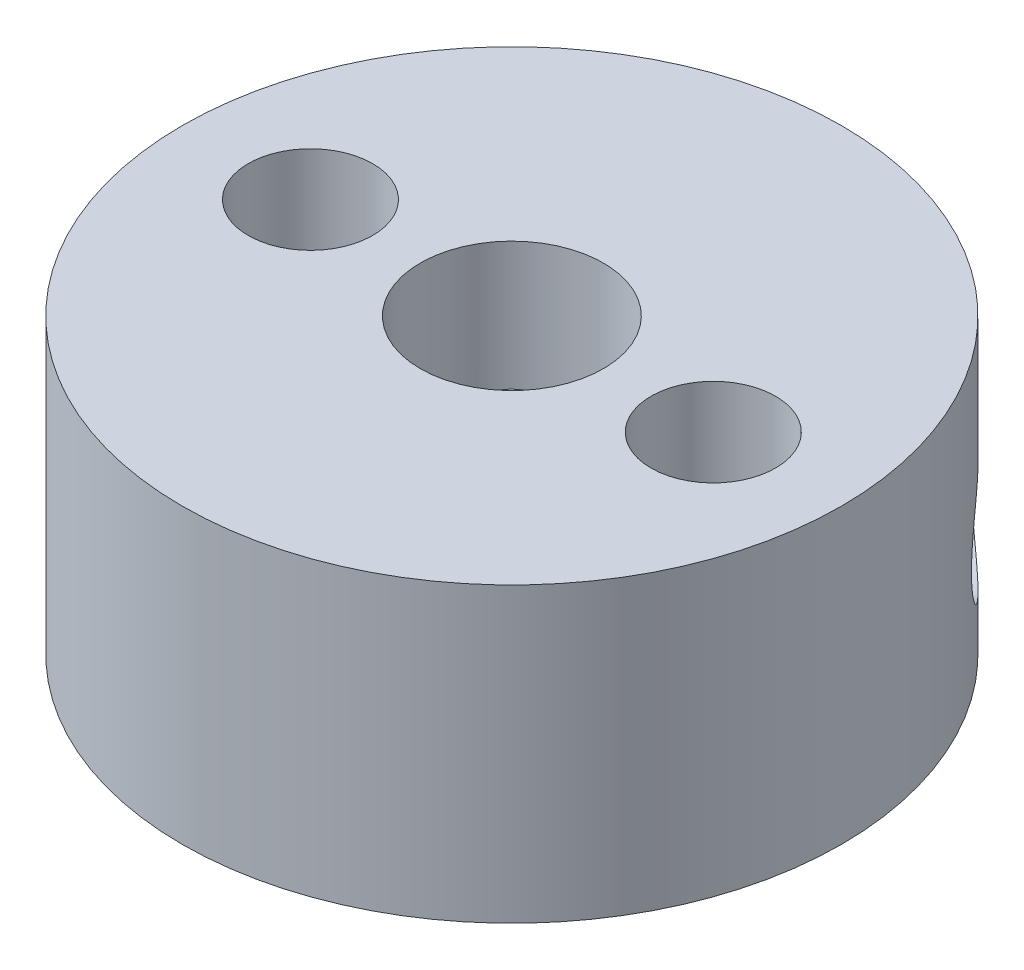
ISO-10303-21;
HEADER;
FILE_DESCRIPTION(('STEP AP214'),'2;1');
FILE_NAME('part.step','',(''),(''),'','','');
FILE_SCHEMA(('AUTOMOTIVE_DESIGN { 1 0 10303 214 1 1 1 1 }'));
ENDSEC;
DATA;
#1=APPLICATION_CONTEXT('core data for automotive mechanical design processes');
#2=APPLICATION_PROTOCOL_DEFINITION('international standard','automotive_design',2000,#1);
#3=PRODUCT_CONTEXT('',#1,'mechanical');
#4=PRODUCT('Part','Part','',(#3));
#5=PRODUCT_RELATED_PRODUCT_CATEGORY('part','',(#4));
#6=PRODUCT_DEFINITION_FORMATION('','',#4);
#7=PRODUCT_DEFINITION_CONTEXT('part definition',#1,'design');
#8=PRODUCT_DEFINITION('design','',#6,#7);
#9=PRODUCT_DEFINITION_SHAPE('','',#8);
#10=(LENGTH_UNIT() NAMED_UNIT(*) SI_UNIT(.MILLI.,.METRE.));
#11=(NAMED_UNIT(*) PLANE_ANGLE_UNIT() SI_UNIT($,.RADIAN.));
#12=(NAMED_UNIT(*) SI_UNIT($,.STERADIAN.) SOLID_ANGLE_UNIT());
#13=UNCERTAINTY_MEASURE_WITH_UNIT(LENGTH_MEASURE(1.E-05),#10,'distance_accuracy_value','');
#14=(GEOMETRIC_REPRESENTATION_CONTEXT(3) GLOBAL_UNCERTAINTY_ASSIGNED_CONTEXT((#13)) GLOBAL_UNIT_ASSIGNED_CONTEXT((#10,
#11,#12)) REPRESENTATION_CONTEXT('',''));
#15=CARTESIAN_POINT('',(0.,0.,0.));
#16=DIRECTION('',(0.,0.,1.));
#17=DIRECTION('',(1.,0.,0.));
#18=AXIS2_PLACEMENT_3D('',#15,#16,#17);
#19=CARTESIAN_POINT('',(0.,8.,0.));
#20=DIRECTION('',(0.,-1.,0.));
#21=DIRECTION('',(0.,0.,-1.));
#22=AXIS2_PLACEMENT_3D('',#19,#20,#21);
#23=CYLINDRICAL_SURFACE('',#22,9.);
#24=CARTESIAN_POINT('',(7.3356103707854,3.,-5.21429002722573));
#25=CARTESIAN_POINT('',(7.33560906179699,3.08362544888762,-5.21429347133471));
#26=CARTESIAN_POINT('',(7.3314935824208,3.16729656361492,-5.22009663199539));
#27=CARTESIAN_POINT('',(7.31507706919098,3.3322911259321,-5.24307536332879));
#28=CARTESIAN_POINT('',(7.30276848653905,3.41361233624971,-5.26026142167641));
#29=CARTESIAN_POINT('',(7.27014056128942,3.57149537001407,-5.30526373763786));
#30=CARTESIAN_POINT('',(7.24982791339226,3.64806110919979,-5.33307111085623));
#31=CARTESIAN_POINT('',(7.20147069847817,3.79438857282823,-5.39819015859343));
#32=CARTESIAN_POINT('',(7.1734270015503,3.86415106174574,-5.43550076353738));
#33=CARTESIAN_POINT('',(7.10972063245059,3.9955877098474,-5.51857125287341));
#34=CARTESIAN_POINT('',(7.07399292404927,4.05718507883191,-5.56440277761031));
#35=CARTESIAN_POINT('',(6.995625236568,4.16987598411691,-5.66261128747882));
#36=CARTESIAN_POINT('',(6.95298484807467,4.2209688978692,-5.71498866025553));
#37=CARTESIAN_POINT('',(6.86127498846877,4.31148874033161,-5.82477846281084));
#38=CARTESIAN_POINT('',(6.81216865669268,4.3508442046391,-5.88221908419585));
#39=CARTESIAN_POINT('',(6.70875322313891,4.41631264231832,-5.99989653222549));
#40=CARTESIAN_POINT('',(6.65444445992396,4.44242647673092,-6.06013317677978));
#41=CARTESIAN_POINT('',(6.54245362251156,4.48043552099034,-6.1808586801218));
#42=CARTESIAN_POINT('',(6.48480731247121,4.49245974960282,-6.24134007868412));
#43=CARTESIAN_POINT('',(6.36723892837099,4.50234945249156,-6.36123534952202));
#44=CARTESIAN_POINT('',(6.30731700927169,4.50021588914834,-6.42064929408283));
#45=CARTESIAN_POINT('',(6.187554745874,4.48195118908307,-6.53613195882861));
#46=CARTESIAN_POINT('',(6.12771947201005,4.46595890195451,-6.5922279835377));
#47=CARTESIAN_POINT('',(6.00937716266979,4.42064935545211,-6.70028439304207));
#48=CARTESIAN_POINT('',(5.95087016770395,4.3913316902463,-6.75224465182361));
#49=CARTESIAN_POINT('',(5.83680055263428,4.32006561581081,-6.85109387827042));
#50=CARTESIAN_POINT('',(5.78125263940363,4.27805999275054,-6.89795853845665));
#51=CARTESIAN_POINT('',(5.6752497105551,4.18265230641897,-6.98543275865623));
#52=CARTESIAN_POINT('',(5.62479510761948,4.12924932077351,-7.02604181195296));
#53=CARTESIAN_POINT('',(5.53016818209831,4.01179271602842,-7.10076938918105));
#54=CARTESIAN_POINT('',(5.48607950274169,3.94761774305941,-7.13480319252956));
#55=CARTESIAN_POINT('',(5.4065773438134,3.81084774587051,-7.19523612452328));
#56=CARTESIAN_POINT('',(5.37116394426471,3.73825264399031,-7.22163518274408));
#57=CARTESIAN_POINT('',(5.31038314614654,3.58656501487351,-7.26644791244958));
#58=CARTESIAN_POINT('',(5.28502704422252,3.50746530114475,-7.28485260662859));
#59=CARTESIAN_POINT('',(5.2454872496074,3.34509055661548,-7.31337566673685));
#60=CARTESIAN_POINT('',(5.23130257318053,3.26181589414055,-7.32349476228423));
#61=CARTESIAN_POINT('',(5.214823858166,3.09452030630272,-7.33523787599168));
#62=CARTESIAN_POINT('',(5.21238982988897,3.01052017217874,-7.33696190969075));
#63=CARTESIAN_POINT('',(5.21913859650674,2.84322799698551,-7.33216262818446));
#64=CARTESIAN_POINT('',(5.22832094270758,2.75993592869162,-7.32563963152882));
#65=CARTESIAN_POINT('',(5.25780894880967,2.59696334448549,-7.30450322393505));
#66=CARTESIAN_POINT('',(5.27804387945267,2.51726331607319,-7.28994125088023));
#67=CARTESIAN_POINT('',(5.32875141663331,2.36311790023231,-7.25295713819659));
#68=CARTESIAN_POINT('',(5.35922463560947,2.28867282746946,-7.23053452835318));
#69=CARTESIAN_POINT('',(5.42953410343629,2.14639524335634,-7.17788956661402));
#70=CARTESIAN_POINT('',(5.46945411987631,2.07863005634637,-7.14759718124592));
#71=CARTESIAN_POINT('',(5.55699261394945,1.952331880383,-7.07975227072709));
#72=CARTESIAN_POINT('',(5.60461163304169,1.89379954133416,-7.04219923490947));
#73=CARTESIAN_POINT('',(5.70636706168378,1.78700886436278,-6.96000635037759));
#74=CARTESIAN_POINT('',(5.76056610033209,1.73886370422928,-6.91529686201643));
#75=CARTESIAN_POINT('',(5.87317561280523,1.65500680379707,-6.81991532253652));
#76=CARTESIAN_POINT('',(5.93158595032937,1.61929466131569,-6.7692434643592));
#77=CARTESIAN_POINT('',(6.05038089421133,1.56149364962708,-6.66327196304475));
#78=CARTESIAN_POINT('',(6.11075568766486,1.53934555455905,-6.60799365357937));
#79=CARTESIAN_POINT('',(6.23177099454667,1.5091106406217,-6.49399226841619));
#80=CARTESIAN_POINT('',(6.29241148569924,1.50102266476058,-6.43526947657221));
#81=CARTESIAN_POINT('',(6.41138172764823,1.49917087061269,-6.31673581667009));
#82=CARTESIAN_POINT('',(6.46973056399896,1.50523484763537,-6.25694672375754));
#83=CARTESIAN_POINT('',(6.58327745018212,1.53114235336164,-6.13736575342292));
#84=CARTESIAN_POINT('',(6.63847551765573,1.55098580490574,-6.07757387601833));
#85=CARTESIAN_POINT('',(6.74429948508754,1.60382289932625,-5.95992309059098));
#86=CARTESIAN_POINT('',(6.79493039892556,1.63680190092627,-5.90206210789744));
#87=CARTESIAN_POINT('',(6.89060342251367,1.71495476173811,-5.79007901446971));
#88=CARTESIAN_POINT('',(6.93564526718358,1.76012919903658,-5.73595708112629));
#89=CARTESIAN_POINT('',(7.01978386374087,1.8620010554772,-5.63268393285002));
#90=CARTESIAN_POINT('',(7.05880658428743,1.91882457285412,-5.58359677706004));
#91=CARTESIAN_POINT('',(7.1296418120033,2.04211698473892,-5.49286168718718));
#92=CARTESIAN_POINT('',(7.16145262820669,2.10858813533493,-5.45121549826225));
#93=CARTESIAN_POINT('',(7.21757936392886,2.24984719350458,-5.37668546051094));
#94=CARTESIAN_POINT('',(7.24184067656554,2.32469060390283,-5.34386567595149));
#95=CARTESIAN_POINT('',(7.28219857113647,2.48016554154686,-5.28873908330745));
#96=CARTESIAN_POINT('',(7.29830331023487,2.56079119361814,-5.26642177357636));
#97=CARTESIAN_POINT('',(7.31867122213994,2.701442261686,-5.23805812236942));
#98=CARTESIAN_POINT('',(7.32501827640892,2.76061608477506,-5.22916445343277));
#99=CARTESIAN_POINT('',(7.33348828265055,2.87985209090466,-5.21727922212014));
#100=CARTESIAN_POINT('',(7.33561131130699,2.9399142577981,-5.21428755259813));
#101=CARTESIAN_POINT('',(7.3356103707854,3.,-5.21429002722573));
#102=B_SPLINE_CURVE_WITH_KNOTS('',3,(#24,#25,#26,#27,#28,#29,#30,#31,#32,#33,#34,#35,#36,#37,
#38,#39,#40,#41,#42,#43,#44,#45,#46,#47,#48,#49,#50,#51,#52,#53,#54,#55,#56,#57,#58,#59,#60,#61,
#62,#63,#64,#65,#66,#67,#68,#69,#70,#71,#72,#73,#74,#75,#76,#77,#78,#79,#80,#81,#82,#83,#84,#85,
#86,#87,#88,#89,#90,#91,#92,#93,#94,#95,#96,#97,#98,#99,#100,#101),.UNSPECIFIED.,.T.,.F.,(4,2,2,
2,2,2,2,2,2,2,2,2,2,2,2,2,2,2,2,2,2,2,2,2,2,2,2,2,2,2,2,2,2,2,2,2,2,2,4),(0.,0.250656623343192,
0.501544511951669,0.752222998698999,1.00287328440553,1.25573495490817,1.50861160698057,
1.7629978806425,2.01736761064056,2.26938940480928,2.52139406789004,2.7709027269619,
3.02041898547108,3.27107762481044,3.52175655733447,3.77547674074663,4.02919926445,
4.28320597496551,4.53719031560235,4.78814125449635,5.03908250045774,5.28843638778684,
5.53780519373533,5.7894740565501,6.04116062655802,6.29546467818618,6.54976050283408,
6.80293790647977,7.05609447544799,7.30618665756939,7.55627743928683,7.80609023896863,
8.0559148823279,8.3086019847534,8.56134827326476,8.8158823656771,9.07016140042576,
9.25026402322163,9.43036337636995),.UNSPECIFIED.);
#103=CARTESIAN_POINT('',(7.3356103707854,3.,-5.21429002722573));
#104=VERTEX_POINT('',#103);
#105=EDGE_CURVE('E81',#104,#104,#102,.T.);
#106=ORIENTED_EDGE('',*,*,#105,.T.);
#107=EDGE_LOOP('',(#106));
#108=FACE_BOUND('',#107,.T.);
#109=CARTESIAN_POINT('',(0.,8.,0.));
#110=DIRECTION('',(0.,1.,0.));
#111=DIRECTION('',(0.,0.,1.));
#112=AXIS2_PLACEMENT_3D('',#109,#110,#111);
#113=CIRCLE('',#112,9.);
#114=CARTESIAN_POINT('',(0.,8.,9.));
#115=VERTEX_POINT('',#114);
#116=EDGE_CURVE('E11',#115,#115,#113,.T.);
#117=ORIENTED_EDGE('',*,*,#116,.F.);
#118=EDGE_LOOP('',(#117));
#119=FACE_BOUND('',#118,.T.);
#120=CARTESIAN_POINT('',(0.,0.,0.));
#121=DIRECTION('',(0.,1.,0.));
#122=DIRECTION('',(0.,0.,1.));
#123=AXIS2_PLACEMENT_3D('',#120,#121,#122);
#124=CIRCLE('',#123,9.);
#125=CARTESIAN_POINT('',(0.,0.,9.));
#126=VERTEX_POINT('',#125);
#127=EDGE_CURVE('E65',#126,#126,#124,.T.);
#128=ORIENTED_EDGE('',*,*,#127,.T.);
#129=EDGE_LOOP('',(#128));
#130=FACE_BOUND('',#129,.T.);
#131=CARTESIAN_POINT('',(-5.21429002722576,3.,-7.33561037078538));
#132=CARTESIAN_POINT('',(-5.21429347133474,2.91637455111238,-7.33560906179697));
#133=CARTESIAN_POINT('',(-5.22009663199541,2.83270343638508,-7.33149358242078));
#134=CARTESIAN_POINT('',(-5.24307536332881,2.6677088740679,-7.31507706919096));
#135=CARTESIAN_POINT('',(-5.26026142167643,2.58638766375029,-7.30276848653903));
#136=CARTESIAN_POINT('',(-5.30526373763789,2.42850462998593,-7.2701405612894));
#137=CARTESIAN_POINT('',(-5.33307111085626,2.35193889080021,-7.24982791339224));
#138=CARTESIAN_POINT('',(-5.39819015859346,2.20561142717178,-7.20147069847815));
#139=CARTESIAN_POINT('',(-5.43550076353741,2.13584893825426,-7.17342700155028));
#140=CARTESIAN_POINT('',(-5.51857125287343,2.0044122901526,-7.10972063245057));
#141=CARTESIAN_POINT('',(-5.56440277761034,1.94281492116809,-7.07399292404925));
#142=CARTESIAN_POINT('',(-5.66261128747885,1.83012401588309,-6.99562523656798));
#143=CARTESIAN_POINT('',(-5.71498866025555,1.7790311021308,-6.95298484807465));
#144=CARTESIAN_POINT('',(-5.82477846281086,1.68851125966839,-6.86127498846875));
#145=CARTESIAN_POINT('',(-5.88221908419588,1.6491557953609,-6.81216865669266));
#146=CARTESIAN_POINT('',(-5.99989653222551,1.58368735768168,-6.70875322313889));
#147=CARTESIAN_POINT('',(-6.06013317677981,1.55757352326908,-6.65444445992394));
#148=CARTESIAN_POINT('',(-6.18085868012182,1.51956447900966,-6.54245362251154));
#149=CARTESIAN_POINT('',(-6.24134007868415,1.50754025039718,-6.48480731247119));
#150=CARTESIAN_POINT('',(-6.36123534952204,1.49765054750844,-6.36723892837096));
#151=CARTESIAN_POINT('',(-6.42064929408285,1.49978411085166,-6.30731700927167));
#152=CARTESIAN_POINT('',(-6.53613195882863,1.51804881091693,-6.18755474587398));
#153=CARTESIAN_POINT('',(-6.59222798353772,1.53404109804549,-6.12771947201003));
#154=CARTESIAN_POINT('',(-6.70028439304209,1.57935064454789,-6.00937716266976));
#155=CARTESIAN_POINT('',(-6.75224465182364,1.6086683097537,-5.95087016770393));
#156=CARTESIAN_POINT('',(-6.85109387827044,1.67993438418919,-5.83680055263426));
#157=CARTESIAN_POINT('',(-6.89795853845667,1.72194000724946,-5.78125263940361));
#158=CARTESIAN_POINT('',(-6.98543275865625,1.81734769358103,-5.67524971055508));
#159=CARTESIAN_POINT('',(-7.02604181195298,1.87075067922649,-5.62479510761945));
#160=CARTESIAN_POINT('',(-7.10076938918107,1.98820728397158,-5.53016818209829));
#161=CARTESIAN_POINT('',(-7.13480319252958,2.05238225694059,-5.48607950274166));
#162=CARTESIAN_POINT('',(-7.1952361245233,2.18915225412949,-5.40657734381337));
#163=CARTESIAN_POINT('',(-7.2216351827441,2.26174735600969,-5.37116394426468));
#164=CARTESIAN_POINT('',(-7.2664479124496,2.41343498512649,-5.31038314614652));
#165=CARTESIAN_POINT('',(-7.2848526066286,2.49253469885525,-5.28502704422249));
#166=CARTESIAN_POINT('',(-7.31337566673687,2.65490944338453,-5.24548724960737));
#167=CARTESIAN_POINT('',(-7.32349476228425,2.73818410585945,-5.2313025731805));
#168=CARTESIAN_POINT('',(-7.33523787599169,2.90547969369728,-5.21482385816598));
#169=CARTESIAN_POINT('',(-7.33696190969077,2.98947982782126,-5.21238982988894));
#170=CARTESIAN_POINT('',(-7.33216262818448,3.15677200301449,-5.21913859650671));
#171=CARTESIAN_POINT('',(-7.32563963152884,3.24006407130838,-5.22832094270755));
#172=CARTESIAN_POINT('',(-7.30450322393507,3.40303665551451,-5.25780894880965));
#173=CARTESIAN_POINT('',(-7.28994125088025,3.48273668392681,-5.27804387945265));
#174=CARTESIAN_POINT('',(-7.25295713819661,3.63688209976769,-5.32875141663328));
#175=CARTESIAN_POINT('',(-7.2305345283532,3.71132717253054,-5.35922463560945));
#176=CARTESIAN_POINT('',(-7.17788956661404,3.85360475664367,-5.42953410343626));
#177=CARTESIAN_POINT('',(-7.14759718124594,3.92136994365364,-5.46945411987629));
#178=CARTESIAN_POINT('',(-7.07975227072711,4.047668119617,-5.55699261394942));
#179=CARTESIAN_POINT('',(-7.04219923490948,4.10620045866584,-5.60461163304166));
#180=CARTESIAN_POINT('',(-6.96000635037761,4.21299113563722,-5.70636706168376));
#181=CARTESIAN_POINT('',(-6.91529686201645,4.26113629577073,-5.76056610033207));
#182=CARTESIAN_POINT('',(-6.81991532253654,4.34499319620293,-5.87317561280521));
#183=CARTESIAN_POINT('',(-6.76924346435922,4.38070533868431,-5.93158595032934));
#184=CARTESIAN_POINT('',(-6.66327196304477,4.43850635037292,-6.05038089421131));
#185=CARTESIAN_POINT('',(-6.60799365357939,4.46065444544095,-6.11075568766484));
#186=CARTESIAN_POINT('',(-6.49399226841621,4.4908893593783,-6.23177099454665));
#187=CARTESIAN_POINT('',(-6.43526947657223,4.49897733523942,-6.29241148569922));
#188=CARTESIAN_POINT('',(-6.31673581667011,4.50082912938731,-6.41138172764821));
#189=CARTESIAN_POINT('',(-6.25694672375756,4.49476515236463,-6.46973056399893));
#190=CARTESIAN_POINT('',(-6.13736575342294,4.46885764663836,-6.5832774501821));
#191=CARTESIAN_POINT('',(-6.07757387601835,4.44901419509426,-6.63847551765571));
#192=CARTESIAN_POINT('',(-5.959923090591,4.39617710067374,-6.74429948508752));
#193=CARTESIAN_POINT('',(-5.90206210789746,4.36319809907373,-6.79493039892554));
#194=CARTESIAN_POINT('',(-5.79007901446974,4.28504523826189,-6.89060342251365));
#195=CARTESIAN_POINT('',(-5.73595708112631,4.23987080096342,-6.93564526718356));
#196=CARTESIAN_POINT('',(-5.63268393285004,4.1379989445228,-7.01978386374085));
#197=CARTESIAN_POINT('',(-5.58359677706007,4.08117542714588,-7.05880658428741));
#198=CARTESIAN_POINT('',(-5.49286168718721,3.95788301526108,-7.12964181200328));
#199=CARTESIAN_POINT('',(-5.45121549826228,3.89141186466507,-7.16145262820667));
#200=CARTESIAN_POINT('',(-5.37668546051096,3.75015280649542,-7.21757936392884));
#201=CARTESIAN_POINT('',(-5.34386567595152,3.67530939609717,-7.24184067656553));
#202=CARTESIAN_POINT('',(-5.28873908330748,3.51983445845314,-7.28219857113646));
#203=CARTESIAN_POINT('',(-5.26642177357639,3.43920880638187,-7.29830331023486));
#204=CARTESIAN_POINT('',(-5.23805812236944,3.298557738314,-7.31867122213992));
#205=CARTESIAN_POINT('',(-5.22916445343279,3.23938391522494,-7.3250182764089));
#206=CARTESIAN_POINT('',(-5.21727922212016,3.12014790909533,-7.33348828265053));
#207=CARTESIAN_POINT('',(-5.21428755259815,3.0600857422019,-7.33561131130697));
#208=CARTESIAN_POINT('',(-5.21429002722576,3.,-7.33561037078538));
#209=B_SPLINE_CURVE_WITH_KNOTS('',3,(#131,#132,#133,#134,#135,#136,#137,#138,#139,#140,#141,
#142,#143,#144,#145,#146,#147,#148,#149,#150,#151,#152,#153,#154,#155,#156,#157,#158,#159,#160,
#161,#162,#163,#164,#165,#166,#167,#168,#169,#170,#171,#172,#173,#174,#175,#176,#177,#178,#179,
#180,#181,#182,#183,#184,#185,#186,#187,#188,#189,#190,#191,#192,#193,#194,#195,#196,#197,#198,
#199,#200,#201,#202,#203,#204,#205,#206,#207,#208),.UNSPECIFIED.,.T.,.F.,(4,2,2,2,2,2,2,2,2,2,2,
2,2,2,2,2,2,2,2,2,2,2,2,2,2,2,2,2,2,2,2,2,2,2,2,2,2,2,4),(0.,0.250656623343191,
0.501544511951669,0.752222998698999,1.00287328440553,1.25573495490818,1.50861160698057,
1.7629978806425,2.01736761064057,2.26938940480928,2.52139406789004,2.7709027269619,
3.02041898547109,3.27107762481044,3.52175655733447,3.77547674074663,4.02919926445,
4.28320597496551,4.53719031560235,4.78814125449635,5.03908250045774,5.28843638778684,
5.53780519373533,5.7894740565501,6.04116062655803,6.29546467818618,6.54976050283408,
6.80293790647977,7.05609447544799,7.30618665756939,7.55627743928683,7.80609023896863,
8.0559148823279,8.3086019847534,8.56134827326476,8.8158823656771,9.07016140042576,
9.25026402322163,9.43036337636995),.UNSPECIFIED.);
#210=CARTESIAN_POINT('',(-5.21429002722576,3.,-7.33561037078538));
#211=VERTEX_POINT('',#210);
#212=EDGE_CURVE('E82',#211,#211,#209,.T.);
#213=ORIENTED_EDGE('',*,*,#212,.F.);
#214=EDGE_LOOP('',(#213));
#215=FACE_BOUND('',#214,.T.);
#216=ADVANCED_FACE('F52',(#108,#119,#130,#215),#23,.T.);
#217=CARTESIAN_POINT('',(0.,8.,0.));
#218=DIRECTION('',(0.,-1.,0.));
#219=DIRECTION('',(0.,0.,-1.));
#220=AXIS2_PLACEMENT_3D('',#217,#218,#219);
#221=CYLINDRICAL_SURFACE('',#220,2.5);
#222=CARTESIAN_POINT('',(0.,0.,0.));
#223=DIRECTION('',(0.,1.,0.));
#224=DIRECTION('',(0.,0.,1.));
#225=AXIS2_PLACEMENT_3D('',#222,#223,#224);
#226=CIRCLE('',#225,2.5);
#227=CARTESIAN_POINT('',(0.,0.,2.5));
#228=VERTEX_POINT('',#227);
#229=EDGE_CURVE('E73',#228,#228,#226,.T.);
#230=ORIENTED_EDGE('',*,*,#229,.F.);
#231=EDGE_LOOP('',(#230));
#232=FACE_BOUND('',#231,.T.);
#233=CARTESIAN_POINT('',(0.,8.,0.));
#234=DIRECTION('',(0.,1.,0.));
#235=DIRECTION('',(0.,0.,1.));
#236=AXIS2_PLACEMENT_3D('',#233,#234,#235);
#237=CIRCLE('',#236,2.5);
#238=CARTESIAN_POINT('',(0.,8.,2.5));
#239=VERTEX_POINT('',#238);
#240=EDGE_CURVE('E70',#239,#239,#237,.T.);
#241=ORIENTED_EDGE('',*,*,#240,.T.);
#242=EDGE_LOOP('',(#241));
#243=FACE_BOUND('',#242,.T.);
#244=CARTESIAN_POINT('',(2.47487373415292,3.,-0.35355339059327));
#245=CARTESIAN_POINT('',(2.47487246667181,3.07547897528964,-0.353546408153655));
#246=CARTESIAN_POINT('',(2.47388722634238,3.1509384340798,-0.36067240787789));
#247=CARTESIAN_POINT('',(2.46969457131063,3.29932390396222,-0.388326253702032));
#248=CARTESIAN_POINT('',(2.46648483731632,3.3722471873851,-0.408868086069917));
#249=CARTESIAN_POINT('',(2.45723725621327,3.51308364167728,-0.461166930046225));
#250=CARTESIAN_POINT('',(2.45121974438268,3.58102883803527,-0.49284290247516));
#251=CARTESIAN_POINT('',(2.43555021280432,3.71143745336792,-0.565211633090872));
#252=CARTESIAN_POINT('',(2.42589710850616,3.77389922969514,-0.605907080426623));
#253=CARTESIAN_POINT('',(2.40062672546779,3.89994901666408,-0.699733791789156));
#254=CARTESIAN_POINT('',(2.3844245271351,3.96274095712394,-0.753777183578229));
#255=CARTESIAN_POINT('',(2.34514107038064,4.07976476274176,-0.868323083502424));
#256=CARTESIAN_POINT('',(2.32205464526177,4.1339901516708,-0.928830420942369));
#257=CARTESIAN_POINT('',(2.26500305980942,4.2381338097097,-1.06088171623673));
#258=CARTESIAN_POINT('',(2.23013229037941,4.28695446366975,-1.1329118764263));
#259=CARTESIAN_POINT('',(2.14966973800059,4.37080972244443,-1.27900317864646));
#260=CARTESIAN_POINT('',(2.10408785185208,4.40585697412271,-1.35306239041441));
#261=CARTESIAN_POINT('',(2.00710936471576,4.45759592281265,-1.49265890769673));
#262=CARTESIAN_POINT('',(1.95668307188288,4.4757203609673,-1.55833489360879));
#263=CARTESIAN_POINT('',(1.84817906693828,4.49794280286312,-1.6855862132963));
#264=CARTESIAN_POINT('',(1.79010859313577,4.50205397800006,-1.74716534438174));
#265=CARTESIAN_POINT('',(1.67598197785688,4.49638625265754,-1.85648835558264));
#266=CARTESIAN_POINT('',(1.62056891777071,4.48826647383069,-1.90500096992575));
#267=CARTESIAN_POINT('',(1.50727992086986,4.46152020435189,-1.9958401756196));
#268=CARTESIAN_POINT('',(1.44940380206955,4.44289293609285,-2.03816630884767));
#269=CARTESIAN_POINT('',(1.33274941048181,4.39583443729622,-2.11630402374595));
#270=CARTESIAN_POINT('',(1.27396785139536,4.367346938861,-2.15207637412186));
#271=CARTESIAN_POINT('',(1.15760996770867,4.30161538377446,-2.21683988890781));
#272=CARTESIAN_POINT('',(1.1000339603586,4.26436905294099,-2.24582928825584));
#273=CARTESIAN_POINT('',(0.98097276785586,4.17716090719555,-2.3005390511511));
#274=CARTESIAN_POINT('',(0.919842095235206,4.12621168826426,-2.32545534862582));
#275=CARTESIAN_POINT('',(0.803160790975088,4.01559588213982,-2.36829167154116));
#276=CARTESIAN_POINT('',(0.747617886068207,3.95591749652549,-2.38620210546875));
#277=CARTESIAN_POINT('',(0.638420106826199,3.82134659383645,-2.41785202736695));
#278=CARTESIAN_POINT('',(0.585729980254846,3.74549242346054,-2.43086761236321));
#279=CARTESIAN_POINT('',(0.493939983476181,3.58529376836339,-2.45117219898395));
#280=CARTESIAN_POINT('',(0.454815100406054,3.50096528387436,-2.45847177195494));
#281=CARTESIAN_POINT('',(0.401766534020127,3.34760636810465,-2.46761430908628));
#282=CARTESIAN_POINT('',(0.384001304686429,3.27995936770336,-2.4703609216188));
#283=CARTESIAN_POINT('',(0.359997099284241,3.14262638970052,-2.47397587494313));
#284=CARTESIAN_POINT('',(0.353744718218249,3.07294287951544,-2.47484640036063));
#285=CARTESIAN_POINT('',(0.353370484746891,2.93344831756429,-2.47489986482797));
#286=CARTESIAN_POINT('',(0.359265438248724,2.86363722278479,-2.47408046585637));
#287=CARTESIAN_POINT('',(0.382624178224618,2.72601265625144,-2.47057319106248));
#288=CARTESIAN_POINT('',(0.400097109011791,2.65820080775975,-2.46788383826344));
#289=CARTESIAN_POINT('',(0.445077443669985,2.52628542052021,-2.4601664855196));
#290=CARTESIAN_POINT('',(0.472572308833644,2.46217736346777,-2.45514140571206));
#291=CARTESIAN_POINT('',(0.535812131750185,2.33852228426982,-2.44211913719114));
#292=CARTESIAN_POINT('',(0.571560201036048,2.278976993634,-2.43412082684719));
#293=CARTESIAN_POINT('',(0.656685680933418,2.15475991748775,-2.41267845122131));
#294=CARTESIAN_POINT('',(0.707358343878446,2.09109916490343,-2.39851258312416));
#295=CARTESIAN_POINT('',(0.815537075541728,1.97171451515054,-2.36392267205626));
#296=CARTESIAN_POINT('',(0.873049667490603,1.91599830783088,-2.34349262517129));
#297=CARTESIAN_POINT('',(1.00061366935403,1.80677599264957,-2.2921793303144));
#298=CARTESIAN_POINT('',(1.07132309453755,1.75449927339416,-2.26028228874783));
#299=CARTESIAN_POINT('',(1.21570980240182,1.66309722316335,-2.18600611283561));
#300=CARTESIAN_POINT('',(1.28938508077915,1.62396317215908,-2.14363396115489));
#301=CARTESIAN_POINT('',(1.43095966677042,1.56313179656863,-2.05157347595458));
#302=CARTESIAN_POINT('',(1.4988895407459,1.54037377220889,-2.00264084553968));
#303=CARTESIAN_POINT('',(1.63131254469013,1.50928539715374,-1.8963122150036));
#304=CARTESIAN_POINT('',(1.69580948581846,1.50093870928238,-1.8389258785253));
#305=CARTESIAN_POINT('',(1.8103475287881,1.49932539141407,-1.72576055438429));
#306=CARTESIAN_POINT('',(1.86116950472194,1.50419666543697,-1.67078724963479));
#307=CARTESIAN_POINT('',(1.95676120900449,1.52489382438161,-1.55774261169261));
#308=CARTESIAN_POINT('',(2.00153086993345,1.5407198313216,-1.49967124399911));
#309=CARTESIAN_POINT('',(2.08358895406424,1.58221957158378,-1.38334749810206));
#310=CARTESIAN_POINT('',(2.12098567076715,1.60773159612924,-1.32511290079527));
#311=CARTESIAN_POINT('',(2.1890720247914,1.66764059455475,-1.20933036422144));
#312=CARTESIAN_POINT('',(2.21976015521645,1.7020395608596,-1.15178258196701));
#313=CARTESIAN_POINT('',(2.2777309294676,1.78292519656876,-1.03285014382609));
#314=CARTESIAN_POINT('',(2.30428219862575,1.83031870901687,-0.971727179341672));
#315=CARTESIAN_POINT('',(2.35036396008821,1.93375303371772,-0.854270946260955));
#316=CARTESIAN_POINT('',(2.36988659385382,1.98980342560791,-0.797943092330647));
#317=CARTESIAN_POINT('',(2.40500551024305,2.1172855621777,-0.685449446213559));
#318=CARTESIAN_POINT('',(2.41978992451486,2.1897664861655,-0.630210047328199));
#319=CARTESIAN_POINT('',(2.44328926612509,2.34348485276654,-0.531883226664853));
#320=CARTESIAN_POINT('',(2.45200735136374,2.42471771398141,-0.488789489279088));
#321=CARTESIAN_POINT('',(2.46438818616807,2.5870642851372,-0.421738895027599));
#322=CARTESIAN_POINT('',(2.46841920611019,2.66759523596125,-0.39646161839847));
#323=CARTESIAN_POINT('',(2.47365963577269,2.83209739470368,-0.362390557149024));
#324=CARTESIAN_POINT('',(2.47487514370297,2.91606076575871,-0.353561155677948));
#325=CARTESIAN_POINT('',(2.47487373415292,3.,-0.35355339059327));
#326=B_SPLINE_CURVE_WITH_KNOTS('',3,(#244,#245,#246,#247,#248,#249,#250,#251,#252,#253,#254,
#255,#256,#257,#258,#259,#260,#261,#262,#263,#264,#265,#266,#267,#268,#269,#270,#271,#272,#273,
#274,#275,#276,#277,#278,#279,#280,#281,#282,#283,#284,#285,#286,#287,#288,#289,#290,#291,#292,
#293,#294,#295,#296,#297,#298,#299,#300,#301,#302,#303,#304,#305,#306,#307,#308,#309,#310,#311,
#312,#313,#314,#315,#316,#317,#318,#319,#320,#321,#322,#323,#324,#325),.UNSPECIFIED.,.T.,.F.,(4,
2,2,2,2,2,2,2,2,2,2,2,2,2,2,2,2,2,2,2,2,2,2,2,2,2,2,2,2,2,2,2,2,2,2,2,2,2,2,2,4),(0.,
0.226085249493392,0.45240657433077,0.677113624991876,0.901887762215932,1.15414462390001,
1.40659128601844,1.68630157736223,1.9657544327122,2.21853330858497,2.47107452602767,
2.69230130543182,2.91354445887944,3.13607155036377,3.35865648368878,3.60782810055849,
3.85733966656908,4.13576671140276,4.41367760154768,4.62276298054684,4.83160475643976,
5.04073566011181,5.25003193304128,5.45906724365495,5.66818149154661,5.91499438482002,
6.16204457978455,6.44121828011588,6.72020638384847,6.97891479383337,7.23732973022726,
7.46129321849399,7.68525920139648,7.90563970188756,8.12606965394584,8.37042963549487,
8.61506198741955,8.89071695766604,9.16622832484805,9.41820120134354,9.66962780912277),.UNSPECIFIED.);
#327=CARTESIAN_POINT('',(2.47487373415292,3.,-0.35355339059327));
#328=VERTEX_POINT('',#327);
#329=EDGE_CURVE('E75',#328,#328,#326,.T.);
#330=ORIENTED_EDGE('',*,*,#329,.F.);
#331=EDGE_LOOP('',(#330));
#332=FACE_BOUND('',#331,.T.);
#333=CARTESIAN_POINT('',(-0.353553390593279,3.,-2.47487373415292));
#334=CARTESIAN_POINT('',(-0.353546408153663,2.92452102471036,-2.47487246667181));
#335=CARTESIAN_POINT('',(-0.360672407877898,2.8490615659202,-2.47388722634238));
#336=CARTESIAN_POINT('',(-0.388326253702041,2.70067609603778,-2.46969457131063));
#337=CARTESIAN_POINT('',(-0.408868086069927,2.6277528126149,-2.46648483731632));
#338=CARTESIAN_POINT('',(-0.461166930046235,2.48691635832272,-2.45723725621326));
#339=CARTESIAN_POINT('',(-0.492842902475169,2.41897116196473,-2.45121974438268));
#340=CARTESIAN_POINT('',(-0.565211633090881,2.28856254663208,-2.43555021280432));
#341=CARTESIAN_POINT('',(-0.605907080426632,2.22610077030486,-2.42589710850616));
#342=CARTESIAN_POINT('',(-0.699733791789164,2.10005098333592,-2.40062672546779));
#343=CARTESIAN_POINT('',(-0.753777183578238,2.03725904287606,-2.3844245271351));
#344=CARTESIAN_POINT('',(-0.868323083502432,1.92023523725825,-2.34514107038063));
#345=CARTESIAN_POINT('',(-0.928830420942377,1.8660098483292,-2.32205464526177));
#346=CARTESIAN_POINT('',(-1.06088171623674,1.7618661902903,-2.26500305980942));
#347=CARTESIAN_POINT('',(-1.13291187642631,1.71304553633025,-2.2301322903794));
#348=CARTESIAN_POINT('',(-1.27900317864647,1.62919027755557,-2.14966973800059));
#349=CARTESIAN_POINT('',(-1.35306239041441,1.59414302587729,-2.10408785185208));
#350=CARTESIAN_POINT('',(-1.49265890769674,1.54240407718735,-2.00710936471575));
#351=CARTESIAN_POINT('',(-1.55833489360879,1.5242796390327,-1.95668307188287));
#352=CARTESIAN_POINT('',(-1.68558621329631,1.50205719713688,-1.84817906693827));
#353=CARTESIAN_POINT('',(-1.74716534438175,1.49794602199995,-1.79010859313577));
#354=CARTESIAN_POINT('',(-1.85648835558264,1.50361374734246,-1.67598197785687));
#355=CARTESIAN_POINT('',(-1.90500096992575,1.51173352616931,-1.62056891777071));
#356=CARTESIAN_POINT('',(-1.9958401756196,1.53847979564811,-1.50727992086986));
#357=CARTESIAN_POINT('',(-2.03816630884768,1.55710706390715,-1.44940380206955));
#358=CARTESIAN_POINT('',(-2.11630402374595,1.60416556270378,-1.3327494104818));
#359=CARTESIAN_POINT('',(-2.15207637412187,1.632653061139,-1.27396785139535));
#360=CARTESIAN_POINT('',(-2.21683988890781,1.69838461622554,-1.15760996770866));
#361=CARTESIAN_POINT('',(-2.24582928825585,1.73563094705901,-1.10003396035859));
#362=CARTESIAN_POINT('',(-2.30053905115111,1.82283909280445,-0.980972767855853));
#363=CARTESIAN_POINT('',(-2.32545534862582,1.87378831173574,-0.919842095235198));
#364=CARTESIAN_POINT('',(-2.36829167154116,1.98440411786017,-0.803160790975079));
#365=CARTESIAN_POINT('',(-2.38620210546876,2.04408250347451,-0.747617886068198));
#366=CARTESIAN_POINT('',(-2.41785202736695,2.17865340616355,-0.638420106826191));
#367=CARTESIAN_POINT('',(-2.43086761236321,2.25450757653946,-0.585729980254838));
#368=CARTESIAN_POINT('',(-2.45117219898396,2.41470623163661,-0.493939983476174));
#369=CARTESIAN_POINT('',(-2.45847177195494,2.49903471612564,-0.454815100406046));
#370=CARTESIAN_POINT('',(-2.46761430908629,2.65239363189535,-0.401766534020118));
#371=CARTESIAN_POINT('',(-2.4703609216188,2.72004063229664,-0.38400130468642));
#372=CARTESIAN_POINT('',(-2.47397587494313,2.85737361029948,-0.359997099284233));
#373=CARTESIAN_POINT('',(-2.47484640036063,2.92705712048456,-0.353744718218242));
#374=CARTESIAN_POINT('',(-2.47489986482797,3.06655168243571,-0.353370484746885));
#375=CARTESIAN_POINT('',(-2.47408046585637,3.13636277721521,-0.359265438248717));
#376=CARTESIAN_POINT('',(-2.47057319106248,3.27398734374856,-0.382624178224609));
#377=CARTESIAN_POINT('',(-2.46788383826344,3.34179919224025,-0.400097109011781));
#378=CARTESIAN_POINT('',(-2.4601664855196,3.47371457947979,-0.445077443669975));
#379=CARTESIAN_POINT('',(-2.45514140571206,3.53782263653223,-0.472572308833635));
#380=CARTESIAN_POINT('',(-2.44211913719114,3.66147771573018,-0.535812131750177));
#381=CARTESIAN_POINT('',(-2.43412082684719,3.721023006366,-0.571560201036039));
#382=CARTESIAN_POINT('',(-2.41267845122131,3.84524008251225,-0.656685680933409));
#383=CARTESIAN_POINT('',(-2.39851258312416,3.90890083509657,-0.707358343878437));
#384=CARTESIAN_POINT('',(-2.36392267205626,4.02828548484946,-0.815537075541721));
#385=CARTESIAN_POINT('',(-2.34349262517129,4.08400169216912,-0.873049667490595));
#386=CARTESIAN_POINT('',(-2.2921793303144,4.19322400735043,-1.00061366935402));
#387=CARTESIAN_POINT('',(-2.26028228874784,4.24550072660584,-1.07132309453754));
#388=CARTESIAN_POINT('',(-2.18600611283561,4.33690277683665,-1.21570980240181));
#389=CARTESIAN_POINT('',(-2.14363396115489,4.37603682784092,-1.28938508077915));
#390=CARTESIAN_POINT('',(-2.05157347595459,4.43686820343137,-1.43095966677042));
#391=CARTESIAN_POINT('',(-2.00264084553969,4.45962622779111,-1.4988895407459));
#392=CARTESIAN_POINT('',(-1.8963122150036,4.49071460284626,-1.63131254469012));
#393=CARTESIAN_POINT('',(-1.8389258785253,4.49906129071762,-1.69580948581845));
#394=CARTESIAN_POINT('',(-1.72576055438429,4.50067460858593,-1.81034752878809));
#395=CARTESIAN_POINT('',(-1.67078724963479,4.49580333456303,-1.86116950472193));
#396=CARTESIAN_POINT('',(-1.55774261169262,4.47510617561839,-1.95676120900449));
#397=CARTESIAN_POINT('',(-1.49967124399912,4.4592801686784,-2.00153086993345));
#398=CARTESIAN_POINT('',(-1.38334749810206,4.41778042841621,-2.08358895406423));
#399=CARTESIAN_POINT('',(-1.32511290079528,4.39226840387076,-2.12098567076714));
#400=CARTESIAN_POINT('',(-1.20933036422145,4.33235940544525,-2.1890720247914));
#401=CARTESIAN_POINT('',(-1.15178258196701,4.2979604391404,-2.21976015521645));
#402=CARTESIAN_POINT('',(-1.03285014382609,4.21707480343124,-2.2777309294676));
#403=CARTESIAN_POINT('',(-0.971727179341679,4.16968129098313,-2.30428219862575));
#404=CARTESIAN_POINT('',(-0.854270946260962,4.06624696628228,-2.3503639600882));
#405=CARTESIAN_POINT('',(-0.797943092330654,4.01019657439209,-2.36988659385381));
#406=CARTESIAN_POINT('',(-0.685449446213566,3.8827144378223,-2.40500551024305));
#407=CARTESIAN_POINT('',(-0.630210047328207,3.8102335138345,-2.41978992451486));
#408=CARTESIAN_POINT('',(-0.531883226664862,3.65651514723346,-2.44328926612508));
#409=CARTESIAN_POINT('',(-0.488789489279098,3.57528228601859,-2.45200735136374));
#410=CARTESIAN_POINT('',(-0.421738895027609,3.4129357148628,-2.46438818616807));
#411=CARTESIAN_POINT('',(-0.396461618398479,3.33240476403876,-2.46841920611019));
#412=CARTESIAN_POINT('',(-0.362390557149032,3.16790260529632,-2.47365963577269));
#413=CARTESIAN_POINT('',(-0.353561155677956,3.08393923424129,-2.47487514370297));
#414=CARTESIAN_POINT('',(-0.353553390593279,3.,-2.47487373415292));
#415=B_SPLINE_CURVE_WITH_KNOTS('',3,(#333,#334,#335,#336,#337,#338,#339,#340,#341,#342,#343,
#344,#345,#346,#347,#348,#349,#350,#351,#352,#353,#354,#355,#356,#357,#358,#359,#360,#361,#362,
#363,#364,#365,#366,#367,#368,#369,#370,#371,#372,#373,#374,#375,#376,#377,#378,#379,#380,#381,
#382,#383,#384,#385,#386,#387,#388,#389,#390,#391,#392,#393,#394,#395,#396,#397,#398,#399,#400,
#401,#402,#403,#404,#405,#406,#407,#408,#409,#410,#411,#412,#413,#414),.UNSPECIFIED.,.T.,.F.,(4,
2,2,2,2,2,2,2,2,2,2,2,2,2,2,2,2,2,2,2,2,2,2,2,2,2,2,2,2,2,2,2,2,2,2,2,2,2,2,2,4),(0.,
0.226085249493392,0.45240657433077,0.677113624991877,0.901887762215932,1.15414462390001,
1.40659128601844,1.68630157736223,1.9657544327122,2.21853330858497,2.47107452602766,
2.69230130543181,2.91354445887944,3.13607155036376,3.35865648368878,3.60782810055849,
3.85733966656908,4.13576671140276,4.41367760154768,4.62276298054684,4.83160475643976,
5.04073566011181,5.25003193304128,5.45906724365495,5.66818149154661,5.91499438482002,
6.16204457978454,6.44121828011588,6.72020638384847,6.97891479383337,7.23732973022726,
7.46129321849399,7.68525920139648,7.90563970188756,8.12606965394584,8.37042963549487,
8.61506198741954,8.89071695766603,9.16622832484805,9.41820120134353,9.66962780912277),.UNSPECIFIED.);
#416=CARTESIAN_POINT('',(-0.353553390593279,3.,-2.47487373415292));
#417=VERTEX_POINT('',#416);
#418=EDGE_CURVE('E56',#417,#417,#415,.T.);
#419=ORIENTED_EDGE('',*,*,#418,.T.);
#420=EDGE_LOOP('',(#419));
#421=FACE_BOUND('',#420,.T.);
#422=ADVANCED_FACE('F83',(#232,#243,#332,#421),#221,.F.);
#423=CARTESIAN_POINT('',(0.,8.,0.));
#424=DIRECTION('',(0.,1.,0.));
#425=DIRECTION('',(0.,0.,1.));
#426=AXIS2_PLACEMENT_3D('',#423,#424,#425);
#427=PLANE('',#426);
#428=CARTESIAN_POINT('',(-5.5,8.,0.));
#429=DIRECTION('',(0.,-1.,0.));
#430=DIRECTION('',(0.,0.,-1.));
#431=AXIS2_PLACEMENT_3D('',#428,#429,#430);
#432=CIRCLE('',#431,1.7);
#433=CARTESIAN_POINT('',(-5.5,8.,-1.7));
#434=VERTEX_POINT('',#433);
#435=EDGE_CURVE('E107',#434,#434,#432,.T.);
#436=ORIENTED_EDGE('',*,*,#435,.T.);
#437=EDGE_LOOP('',(#436));
#438=FACE_BOUND('',#437,.T.);
#439=ORIENTED_EDGE('',*,*,#240,.F.);
#440=EDGE_LOOP('',(#439));
#441=FACE_BOUND('',#440,.T.);
#442=ORIENTED_EDGE('',*,*,#116,.T.);
#443=EDGE_LOOP('',(#442));
#444=FACE_BOUND('',#443,.T.);
#445=CARTESIAN_POINT('',(5.5,8.,0.));
#446=DIRECTION('',(0.,1.,0.));
#447=DIRECTION('',(0.,0.,1.));
#448=AXIS2_PLACEMENT_3D('',#445,#446,#447);
#449=CIRCLE('',#448,1.7);
#450=CARTESIAN_POINT('',(5.5,8.,1.7));
#451=VERTEX_POINT('',#450);
#452=EDGE_CURVE('E113',#451,#451,#449,.T.);
#453=ORIENTED_EDGE('',*,*,#452,.F.);
#454=EDGE_LOOP('',(#453));
#455=FACE_BOUND('',#454,.T.);
#456=ADVANCED_FACE('F127',(#438,#441,#444,#455),#427,.T.);
#457=CARTESIAN_POINT('',(0.,0.,0.));
#458=DIRECTION('',(0.,1.,0.));
#459=DIRECTION('',(0.,0.,1.));
#460=AXIS2_PLACEMENT_3D('',#457,#458,#459);
#461=PLANE('',#460);
#462=CARTESIAN_POINT('',(-5.5,0.,0.));
#463=DIRECTION('',(0.,-1.,0.));
#464=DIRECTION('',(0.,0.,-1.));
#465=AXIS2_PLACEMENT_3D('',#462,#463,#464);
#466=CIRCLE('',#465,1.7);
#467=CARTESIAN_POINT('',(-5.5,0.,-1.7));
#468=VERTEX_POINT('',#467);
#469=EDGE_CURVE('E103',#468,#468,#466,.T.);
#470=ORIENTED_EDGE('',*,*,#469,.F.);
#471=EDGE_LOOP('',(#470));
#472=FACE_BOUND('',#471,.T.);
#473=ORIENTED_EDGE('',*,*,#127,.F.);
#474=EDGE_LOOP('',(#473));
#475=FACE_BOUND('',#474,.T.);
#476=ORIENTED_EDGE('',*,*,#229,.T.);
#477=EDGE_LOOP('',(#476));
#478=FACE_BOUND('',#477,.T.);
#479=CARTESIAN_POINT('',(5.5,0.,0.));
#480=DIRECTION('',(0.,1.,0.));
#481=DIRECTION('',(0.,0.,1.));
#482=AXIS2_PLACEMENT_3D('',#479,#480,#481);
#483=CIRCLE('',#482,1.7);
#484=CARTESIAN_POINT('',(5.5,0.,1.7));
#485=VERTEX_POINT('',#484);
#486=EDGE_CURVE('E110',#485,#485,#483,.T.);
#487=ORIENTED_EDGE('',*,*,#486,.T.);
#488=EDGE_LOOP('',(#487));
#489=FACE_BOUND('',#488,.T.);
#490=ADVANCED_FACE('F123',(#472,#475,#478,#489),#461,.F.);
#491=CARTESIAN_POINT('',(5.5,8.,0.));
#492=DIRECTION('',(0.,-1.,0.));
#493=DIRECTION('',(0.,0.,-1.));
#494=AXIS2_PLACEMENT_3D('',#491,#492,#493);
#495=CYLINDRICAL_SURFACE('',#494,1.7);
#496=ORIENTED_EDGE('',*,*,#452,.T.);
#497=EDGE_LOOP('',(#496));
#498=FACE_BOUND('',#497,.T.);
#499=ORIENTED_EDGE('',*,*,#486,.F.);
#500=EDGE_LOOP('',(#499));
#501=FACE_BOUND('',#500,.T.);
#502=ADVANCED_FACE('F148',(#498,#501),#495,.F.);
#503=CARTESIAN_POINT('',(-5.5,8.,0.));
#504=DIRECTION('',(0.,-1.,0.));
#505=DIRECTION('',(0.,0.,-1.));
#506=AXIS2_PLACEMENT_3D('',#503,#504,#505);
#507=CYLINDRICAL_SURFACE('',#506,1.7);
#508=ORIENTED_EDGE('',*,*,#435,.F.);
#509=EDGE_LOOP('',(#508));
#510=FACE_BOUND('',#509,.T.);
#511=ORIENTED_EDGE('',*,*,#469,.T.);
#512=EDGE_LOOP('',(#511));
#513=FACE_BOUND('',#512,.T.);
#514=ADVANCED_FACE('F92',(#510,#513),#507,.F.);
#515=CARTESIAN_POINT('',(9.00000000000002,3.,-8.99999999999999));
#516=DIRECTION('',(-0.707106781186549,0.,0.707106781186546));
#517=DIRECTION('',(0.707106781186546,0.,0.707106781186549));
#518=AXIS2_PLACEMENT_3D('',#515,#516,#517);
#519=CYLINDRICAL_SURFACE('',#518,1.5);
#520=ORIENTED_EDGE('',*,*,#329,.T.);
#521=EDGE_LOOP('',(#520));
#522=FACE_BOUND('',#521,.T.);
#523=ORIENTED_EDGE('',*,*,#105,.F.);
#524=EDGE_LOOP('',(#523));
#525=FACE_BOUND('',#524,.T.);
#526=ADVANCED_FACE('F87',(#522,#525),#519,.F.);
#527=CARTESIAN_POINT('',(-9.00000000000002,3.,-8.99999999999999));
#528=DIRECTION('',(0.707106781186549,0.,0.707106781186546));
#529=DIRECTION('',(0.707106781186546,0.,-0.707106781186549));
#530=AXIS2_PLACEMENT_3D('',#527,#528,#529);
#531=CYLINDRICAL_SURFACE('',#530,1.5);
#532=ORIENTED_EDGE('',*,*,#418,.F.);
#533=EDGE_LOOP('',(#532));
#534=FACE_BOUND('',#533,.T.);
#535=ORIENTED_EDGE('',*,*,#212,.T.);
#536=EDGE_LOOP('',(#535));
#537=FACE_BOUND('',#536,.T.);
#538=ADVANCED_FACE('F91',(#534,#537),#531,.F.);
#539=CLOSED_SHELL('',(#216,#422,#456,#490,#502,#514,#526,#538));
#540=MANIFOLD_SOLID_BREP('B2',#539);
#541=ADVANCED_BREP_SHAPE_REPRESENTATION('',(#18,#540),#14);
#542=SHAPE_DEFINITION_REPRESENTATION(#9,#541);
ENDSEC;
END-ISO-10303-21;
